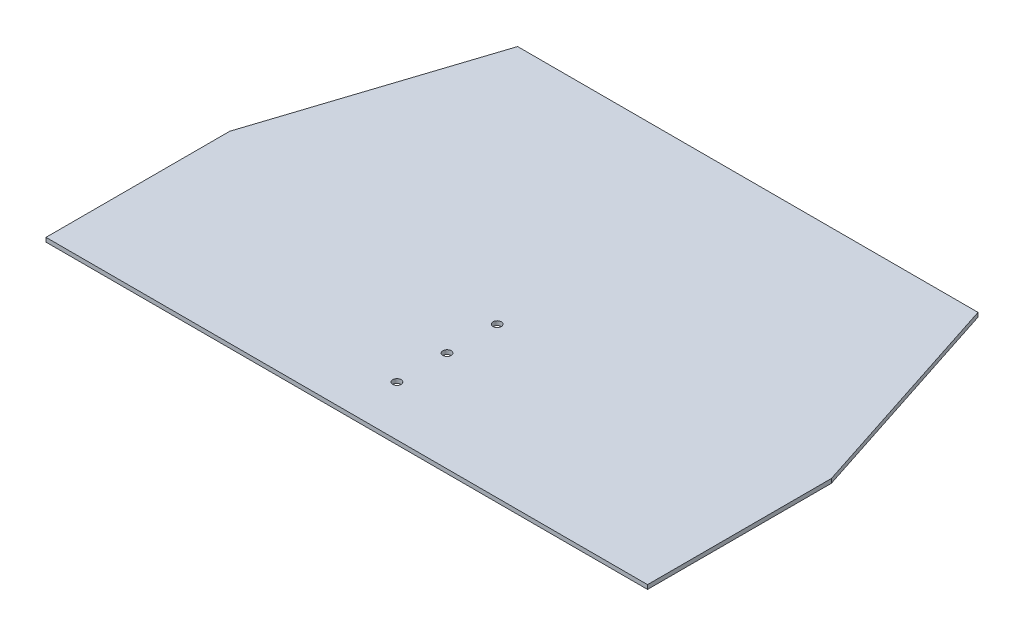
ISO-10303-21;
HEADER;
FILE_DESCRIPTION(('STEP AP214'),'2;1');
FILE_NAME('part.step','',(''),(''),'','','');
FILE_SCHEMA(('AUTOMOTIVE_DESIGN { 1 0 10303 214 1 1 1 1 }'));
ENDSEC;
DATA;
#1=APPLICATION_CONTEXT('core data for automotive mechanical design processes');
#2=APPLICATION_PROTOCOL_DEFINITION('international standard','automotive_design',2000,#1);
#3=PRODUCT_CONTEXT('',#1,'mechanical');
#4=PRODUCT('Part','Part','',(#3));
#5=PRODUCT_RELATED_PRODUCT_CATEGORY('part','',(#4));
#6=PRODUCT_DEFINITION_FORMATION('','',#4);
#7=PRODUCT_DEFINITION_CONTEXT('part definition',#1,'design');
#8=PRODUCT_DEFINITION('design','',#6,#7);
#9=PRODUCT_DEFINITION_SHAPE('','',#8);
#10=(LENGTH_UNIT() NAMED_UNIT(*) SI_UNIT(.MILLI.,.METRE.));
#11=(NAMED_UNIT(*) PLANE_ANGLE_UNIT() SI_UNIT($,.RADIAN.));
#12=(NAMED_UNIT(*) SI_UNIT($,.STERADIAN.) SOLID_ANGLE_UNIT());
#13=UNCERTAINTY_MEASURE_WITH_UNIT(LENGTH_MEASURE(1.E-05),#10,'distance_accuracy_value','');
#14=(GEOMETRIC_REPRESENTATION_CONTEXT(3) GLOBAL_UNCERTAINTY_ASSIGNED_CONTEXT((#13)) GLOBAL_UNIT_ASSIGNED_CONTEXT((#10,
#11,#12)) REPRESENTATION_CONTEXT('',''));
#15=CARTESIAN_POINT('',(0.,0.,0.));
#16=DIRECTION('',(0.,0.,1.));
#17=DIRECTION('',(1.,0.,0.));
#18=AXIS2_PLACEMENT_3D('',#15,#16,#17);
#19=CARTESIAN_POINT('',(228.6,3.175,152.4));
#20=DIRECTION('',(-1.,0.,0.));
#21=DIRECTION('',(0.,0.,1.));
#22=AXIS2_PLACEMENT_3D('',#19,#20,#21);
#23=PLANE('',#22);
#24=DIRECTION('',(0.,0.,-1.));
#25=VECTOR('',#24,1.);
#26=CARTESIAN_POINT('',(228.6,0.,152.4));
#27=LINE('',#26,#25);
#28=CARTESIAN_POINT('',(228.6,0.,152.4));
#29=VERTEX_POINT('',#28);
#30=CARTESIAN_POINT('',(228.6,0.,12.7));
#31=VERTEX_POINT('',#30);
#32=EDGE_CURVE('E102',#29,#31,#27,.T.);
#33=ORIENTED_EDGE('',*,*,#32,.T.);
#34=DIRECTION('',(0.,1.,0.));
#35=VECTOR('',#34,1.);
#36=CARTESIAN_POINT('',(228.6,0.,12.7));
#37=LINE('',#36,#35);
#38=CARTESIAN_POINT('',(228.6,3.175,12.7));
#39=VERTEX_POINT('',#38);
#40=EDGE_CURVE('E46',#31,#39,#37,.T.);
#41=ORIENTED_EDGE('',*,*,#40,.T.);
#42=DIRECTION('',(0.,0.,-1.));
#43=VECTOR('',#42,1.);
#44=CARTESIAN_POINT('',(228.6,3.175,152.4));
#45=LINE('',#44,#43);
#46=CARTESIAN_POINT('',(228.6,3.175,152.4));
#47=VERTEX_POINT('',#46);
#48=EDGE_CURVE('E110',#47,#39,#45,.T.);
#49=ORIENTED_EDGE('',*,*,#48,.F.);
#50=DIRECTION('',(0.,-1.,0.));
#51=VECTOR('',#50,1.);
#52=CARTESIAN_POINT('',(228.6,3.175,152.4));
#53=LINE('',#52,#51);
#54=EDGE_CURVE('E39',#47,#29,#53,.T.);
#55=ORIENTED_EDGE('',*,*,#54,.T.);
#56=EDGE_LOOP('',(#33,#41,#49,#55));
#57=FACE_BOUND('',#56,.T.);
#58=ADVANCED_FACE('F32',(#57),#23,.F.);
#59=CARTESIAN_POINT('',(-228.6,3.175,-152.4));
#60=DIRECTION('',(0.,0.,1.));
#61=DIRECTION('',(1.,0.,0.));
#62=AXIS2_PLACEMENT_3D('',#59,#60,#61);
#63=PLANE('',#62);
#64=DIRECTION('',(-1.,0.,0.));
#65=VECTOR('',#64,1.);
#66=CARTESIAN_POINT('',(-228.6,3.175,-152.4));
#67=LINE('',#66,#65);
#68=CARTESIAN_POINT('',(174.955758151948,3.175,-152.4));
#69=VERTEX_POINT('',#68);
#70=CARTESIAN_POINT('',(-174.955758151948,3.175,-152.4));
#71=VERTEX_POINT('',#70);
#72=EDGE_CURVE('E94',#69,#71,#67,.T.);
#73=ORIENTED_EDGE('',*,*,#72,.F.);
#74=DIRECTION('',(0.,1.,0.));
#75=VECTOR('',#74,1.);
#76=CARTESIAN_POINT('',(174.955758151948,0.,-152.4));
#77=LINE('',#76,#75);
#78=CARTESIAN_POINT('',(174.955758151948,0.,-152.4));
#79=VERTEX_POINT('',#78);
#80=EDGE_CURVE('E85',#79,#69,#77,.T.);
#81=ORIENTED_EDGE('',*,*,#80,.F.);
#82=DIRECTION('',(-1.,0.,0.));
#83=VECTOR('',#82,1.);
#84=CARTESIAN_POINT('',(-228.6,0.,-152.4));
#85=LINE('',#84,#83);
#86=CARTESIAN_POINT('',(-174.955758151948,0.,-152.4));
#87=VERTEX_POINT('',#86);
#88=EDGE_CURVE('E54',#79,#87,#85,.T.);
#89=ORIENTED_EDGE('',*,*,#88,.T.);
#90=DIRECTION('',(0.,1.,0.));
#91=VECTOR('',#90,1.);
#92=CARTESIAN_POINT('',(-174.955758151948,0.,-152.4));
#93=LINE('',#92,#91);
#94=EDGE_CURVE('E106',#87,#71,#93,.T.);
#95=ORIENTED_EDGE('',*,*,#94,.T.);
#96=EDGE_LOOP('',(#73,#81,#89,#95));
#97=FACE_BOUND('',#96,.T.);
#98=ADVANCED_FACE('F93',(#97),#63,.F.);
#99=CARTESIAN_POINT('',(-228.6,3.175,152.4));
#100=DIRECTION('',(1.,0.,0.));
#101=DIRECTION('',(0.,0.,-1.));
#102=AXIS2_PLACEMENT_3D('',#99,#100,#101);
#103=PLANE('',#102);
#104=DIRECTION('',(0.,0.,1.));
#105=VECTOR('',#104,1.);
#106=CARTESIAN_POINT('',(-228.6,3.175,152.4));
#107=LINE('',#106,#105);
#108=CARTESIAN_POINT('',(-228.6,3.175,12.7));
#109=VERTEX_POINT('',#108);
#110=CARTESIAN_POINT('',(-228.6,3.175,152.4));
#111=VERTEX_POINT('',#110);
#112=EDGE_CURVE('E116',#109,#111,#107,.T.);
#113=ORIENTED_EDGE('',*,*,#112,.F.);
#114=DIRECTION('',(0.,1.,0.));
#115=VECTOR('',#114,1.);
#116=CARTESIAN_POINT('',(-228.6,0.,12.7));
#117=LINE('',#116,#115);
#118=CARTESIAN_POINT('',(-228.6,0.,12.7));
#119=VERTEX_POINT('',#118);
#120=EDGE_CURVE('E124',#119,#109,#117,.T.);
#121=ORIENTED_EDGE('',*,*,#120,.F.);
#122=DIRECTION('',(0.,0.,1.));
#123=VECTOR('',#122,1.);
#124=CARTESIAN_POINT('',(-228.6,0.,152.4));
#125=LINE('',#124,#123);
#126=CARTESIAN_POINT('',(-228.6,0.,152.4));
#127=VERTEX_POINT('',#126);
#128=EDGE_CURVE('E101',#119,#127,#125,.T.);
#129=ORIENTED_EDGE('',*,*,#128,.T.);
#130=DIRECTION('',(0.,-1.,0.));
#131=VECTOR('',#130,1.);
#132=CARTESIAN_POINT('',(-228.6,3.175,152.4));
#133=LINE('',#132,#131);
#134=EDGE_CURVE('E11',#111,#127,#133,.T.);
#135=ORIENTED_EDGE('',*,*,#134,.F.);
#136=EDGE_LOOP('',(#113,#121,#129,#135));
#137=FACE_BOUND('',#136,.T.);
#138=ADVANCED_FACE('F173',(#137),#103,.F.);
#139=CARTESIAN_POINT('',(-228.6,3.175,152.4));
#140=DIRECTION('',(0.,0.,-1.));
#141=DIRECTION('',(-1.,0.,0.));
#142=AXIS2_PLACEMENT_3D('',#139,#140,#141);
#143=PLANE('',#142);
#144=DIRECTION('',(1.,0.,0.));
#145=VECTOR('',#144,1.);
#146=CARTESIAN_POINT('',(-228.6,0.,152.4));
#147=LINE('',#146,#145);
#148=EDGE_CURVE('E104',#127,#29,#147,.T.);
#149=ORIENTED_EDGE('',*,*,#148,.T.);
#150=ORIENTED_EDGE('',*,*,#54,.F.);
#151=DIRECTION('',(1.,0.,0.));
#152=VECTOR('',#151,1.);
#153=CARTESIAN_POINT('',(-228.6,3.175,152.4));
#154=LINE('',#153,#152);
#155=EDGE_CURVE('E112',#111,#47,#154,.T.);
#156=ORIENTED_EDGE('',*,*,#155,.F.);
#157=ORIENTED_EDGE('',*,*,#134,.T.);
#158=EDGE_LOOP('',(#149,#150,#156,#157));
#159=FACE_BOUND('',#158,.T.);
#160=ADVANCED_FACE('F163',(#159),#143,.F.);
#161=CARTESIAN_POINT('',(0.,3.175,0.));
#162=DIRECTION('',(0.,-1.,0.));
#163=DIRECTION('',(0.,0.,-1.));
#164=AXIS2_PLACEMENT_3D('',#161,#162,#163);
#165=PLANE('',#164);
#166=CARTESIAN_POINT('',(0.,3.175,76.2));
#167=DIRECTION('',(0.,1.,0.));
#168=DIRECTION('',(0.,0.,1.));
#169=AXIS2_PLACEMENT_3D('',#166,#167,#168);
#170=CIRCLE('',#169,3.175);
#171=CARTESIAN_POINT('',(0.,3.175,79.375));
#172=VERTEX_POINT('',#171);
#173=EDGE_CURVE('E145',#172,#172,#170,.T.);
#174=ORIENTED_EDGE('',*,*,#173,.F.);
#175=EDGE_LOOP('',(#174));
#176=FACE_BOUND('',#175,.T.);
#177=CARTESIAN_POINT('',(0.,3.175,38.1));
#178=DIRECTION('',(0.,1.,0.));
#179=DIRECTION('',(0.,0.,1.));
#180=AXIS2_PLACEMENT_3D('',#177,#178,#179);
#181=CIRCLE('',#180,3.175);
#182=CARTESIAN_POINT('',(0.,3.175,41.275));
#183=VERTEX_POINT('',#182);
#184=EDGE_CURVE('E139',#183,#183,#181,.T.);
#185=ORIENTED_EDGE('',*,*,#184,.F.);
#186=EDGE_LOOP('',(#185));
#187=FACE_BOUND('',#186,.T.);
#188=CARTESIAN_POINT('',(0.,3.175,114.3));
#189=DIRECTION('',(0.,1.,0.));
#190=DIRECTION('',(0.,0.,1.));
#191=AXIS2_PLACEMENT_3D('',#188,#189,#190);
#192=CIRCLE('',#191,3.175);
#193=CARTESIAN_POINT('',(0.,3.175,117.475));
#194=VERTEX_POINT('',#193);
#195=EDGE_CURVE('E133',#194,#194,#192,.T.);
#196=ORIENTED_EDGE('',*,*,#195,.F.);
#197=EDGE_LOOP('',(#196));
#198=FACE_BOUND('',#197,.T.);
#199=ORIENTED_EDGE('',*,*,#48,.T.);
#200=DIRECTION('',(0.309016994374942,0.,0.951056516295155));
#201=VECTOR('',#200,1.);
#202=CARTESIAN_POINT('',(228.6,3.175,12.7));
#203=LINE('',#202,#201);
#204=EDGE_CURVE('E90',#69,#39,#203,.T.);
#205=ORIENTED_EDGE('',*,*,#204,.F.);
#206=ORIENTED_EDGE('',*,*,#72,.T.);
#207=DIRECTION('',(0.309016994374941,0.,-0.951056516295156));
#208=VECTOR('',#207,1.);
#209=CARTESIAN_POINT('',(-228.6,3.175,12.7));
#210=LINE('',#209,#208);
#211=EDGE_CURVE('E95',#109,#71,#210,.T.);
#212=ORIENTED_EDGE('',*,*,#211,.F.);
#213=ORIENTED_EDGE('',*,*,#112,.T.);
#214=ORIENTED_EDGE('',*,*,#155,.T.);
#215=EDGE_LOOP('',(#199,#205,#206,#212,#213,#214));
#216=FACE_BOUND('',#215,.T.);
#217=ADVANCED_FACE('F160',(#176,#187,#198,#216),#165,.F.);
#218=CARTESIAN_POINT('',(0.,0.,0.));
#219=DIRECTION('',(0.,-1.,0.));
#220=DIRECTION('',(0.,0.,-1.));
#221=AXIS2_PLACEMENT_3D('',#218,#219,#220);
#222=PLANE('',#221);
#223=CARTESIAN_POINT('',(0.,0.,76.2));
#224=DIRECTION('',(0.,1.,0.));
#225=DIRECTION('',(0.,0.,1.));
#226=AXIS2_PLACEMENT_3D('',#223,#224,#225);
#227=CIRCLE('',#226,3.175);
#228=CARTESIAN_POINT('',(0.,0.,79.375));
#229=VERTEX_POINT('',#228);
#230=EDGE_CURVE('E136',#229,#229,#227,.T.);
#231=ORIENTED_EDGE('',*,*,#230,.T.);
#232=EDGE_LOOP('',(#231));
#233=FACE_BOUND('',#232,.T.);
#234=CARTESIAN_POINT('',(0.,0.,38.1));
#235=DIRECTION('',(0.,1.,0.));
#236=DIRECTION('',(0.,0.,1.));
#237=AXIS2_PLACEMENT_3D('',#234,#235,#236);
#238=CIRCLE('',#237,3.175);
#239=CARTESIAN_POINT('',(0.,0.,41.275));
#240=VERTEX_POINT('',#239);
#241=EDGE_CURVE('E142',#240,#240,#238,.T.);
#242=ORIENTED_EDGE('',*,*,#241,.T.);
#243=EDGE_LOOP('',(#242));
#244=FACE_BOUND('',#243,.T.);
#245=CARTESIAN_POINT('',(0.,0.,114.3));
#246=DIRECTION('',(0.,1.,0.));
#247=DIRECTION('',(0.,0.,1.));
#248=AXIS2_PLACEMENT_3D('',#245,#246,#247);
#249=CIRCLE('',#248,3.175);
#250=CARTESIAN_POINT('',(0.,0.,117.475));
#251=VERTEX_POINT('',#250);
#252=EDGE_CURVE('E131',#251,#251,#249,.T.);
#253=ORIENTED_EDGE('',*,*,#252,.T.);
#254=EDGE_LOOP('',(#253));
#255=FACE_BOUND('',#254,.T.);
#256=DIRECTION('',(0.309016994374942,0.,0.951056516295155));
#257=VECTOR('',#256,1.);
#258=CARTESIAN_POINT('',(228.6,0.,12.7));
#259=LINE('',#258,#257);
#260=EDGE_CURVE('E83',#79,#31,#259,.T.);
#261=ORIENTED_EDGE('',*,*,#260,.T.);
#262=ORIENTED_EDGE('',*,*,#32,.F.);
#263=ORIENTED_EDGE('',*,*,#148,.F.);
#264=ORIENTED_EDGE('',*,*,#128,.F.);
#265=DIRECTION('',(0.309016994374941,0.,-0.951056516295156));
#266=VECTOR('',#265,1.);
#267=CARTESIAN_POINT('',(-228.6,0.,12.7));
#268=LINE('',#267,#266);
#269=EDGE_CURVE('E100',#119,#87,#268,.T.);
#270=ORIENTED_EDGE('',*,*,#269,.T.);
#271=ORIENTED_EDGE('',*,*,#88,.F.);
#272=EDGE_LOOP('',(#261,#262,#263,#264,#270,#271));
#273=FACE_BOUND('',#272,.T.);
#274=ADVANCED_FACE('F98',(#233,#244,#255,#273),#222,.T.);
#275=CARTESIAN_POINT('',(-228.6,0.,12.7));
#276=DIRECTION('',(0.951056516295156,0.,0.309016994374941));
#277=DIRECTION('',(0.309016994374941,0.,-0.951056516295156));
#278=AXIS2_PLACEMENT_3D('',#275,#276,#277);
#279=PLANE('',#278);
#280=ORIENTED_EDGE('',*,*,#211,.T.);
#281=ORIENTED_EDGE('',*,*,#94,.F.);
#282=ORIENTED_EDGE('',*,*,#269,.F.);
#283=ORIENTED_EDGE('',*,*,#120,.T.);
#284=EDGE_LOOP('',(#280,#281,#282,#283));
#285=FACE_BOUND('',#284,.T.);
#286=ADVANCED_FACE('F177',(#285),#279,.F.);
#287=CARTESIAN_POINT('',(228.6,0.,12.7));
#288=DIRECTION('',(-0.951056516295155,0.,0.309016994374942));
#289=DIRECTION('',(0.309016994374942,0.,0.951056516295155));
#290=AXIS2_PLACEMENT_3D('',#287,#288,#289);
#291=PLANE('',#290);
#292=ORIENTED_EDGE('',*,*,#204,.T.);
#293=ORIENTED_EDGE('',*,*,#40,.F.);
#294=ORIENTED_EDGE('',*,*,#260,.F.);
#295=ORIENTED_EDGE('',*,*,#80,.T.);
#296=EDGE_LOOP('',(#292,#293,#294,#295));
#297=FACE_BOUND('',#296,.T.);
#298=ADVANCED_FACE('F84',(#297),#291,.F.);
#299=CARTESIAN_POINT('',(0.,0.,114.3));
#300=DIRECTION('',(0.,1.,0.));
#301=DIRECTION('',(0.,0.,1.));
#302=AXIS2_PLACEMENT_3D('',#299,#300,#301);
#303=CYLINDRICAL_SURFACE('',#302,3.175);
#304=ORIENTED_EDGE('',*,*,#252,.F.);
#305=EDGE_LOOP('',(#304));
#306=FACE_BOUND('',#305,.T.);
#307=ORIENTED_EDGE('',*,*,#195,.T.);
#308=EDGE_LOOP('',(#307));
#309=FACE_BOUND('',#308,.T.);
#310=ADVANCED_FACE('F184',(#306,#309),#303,.F.);
#311=CARTESIAN_POINT('',(0.,0.,38.1));
#312=DIRECTION('',(0.,1.,0.));
#313=DIRECTION('',(0.,0.,1.));
#314=AXIS2_PLACEMENT_3D('',#311,#312,#313);
#315=CYLINDRICAL_SURFACE('',#314,3.175);
#316=ORIENTED_EDGE('',*,*,#241,.F.);
#317=EDGE_LOOP('',(#316));
#318=FACE_BOUND('',#317,.T.);
#319=ORIENTED_EDGE('',*,*,#184,.T.);
#320=EDGE_LOOP('',(#319));
#321=FACE_BOUND('',#320,.T.);
#322=ADVANCED_FACE('F156',(#318,#321),#315,.F.);
#323=CARTESIAN_POINT('',(0.,0.,76.2));
#324=DIRECTION('',(0.,1.,0.));
#325=DIRECTION('',(0.,0.,1.));
#326=AXIS2_PLACEMENT_3D('',#323,#324,#325);
#327=CYLINDRICAL_SURFACE('',#326,3.175);
#328=ORIENTED_EDGE('',*,*,#230,.F.);
#329=EDGE_LOOP('',(#328));
#330=FACE_BOUND('',#329,.T.);
#331=ORIENTED_EDGE('',*,*,#173,.T.);
#332=EDGE_LOOP('',(#331));
#333=FACE_BOUND('',#332,.T.);
#334=ADVANCED_FACE('F153',(#330,#333),#327,.F.);
#335=CLOSED_SHELL('',(#58,#98,#138,#160,#217,#274,#286,#298,#310,#322,#334));
#336=MANIFOLD_SOLID_BREP('B2',#335);
#337=ADVANCED_BREP_SHAPE_REPRESENTATION('',(#18,#336),#14);
#338=SHAPE_DEFINITION_REPRESENTATION(#9,#337);
ENDSEC;
END-ISO-10303-21;
